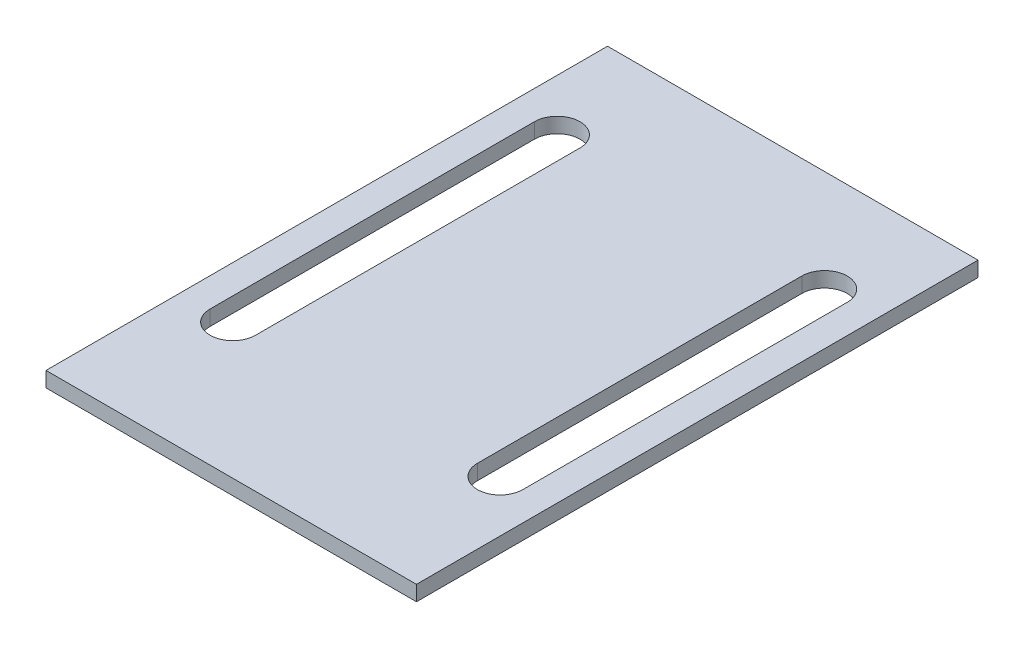
ISO-10303-21;
HEADER;
FILE_DESCRIPTION(('STEP AP214'),'2;1');
FILE_NAME('part.step','',(''),(''),'','','');
FILE_SCHEMA(('AUTOMOTIVE_DESIGN { 1 0 10303 214 1 1 1 1 }'));
ENDSEC;
DATA;
#1=APPLICATION_CONTEXT('core data for automotive mechanical design processes');
#2=APPLICATION_PROTOCOL_DEFINITION('international standard','automotive_design',2000,#1);
#3=PRODUCT_CONTEXT('',#1,'mechanical');
#4=PRODUCT('Part','Part','',(#3));
#5=PRODUCT_RELATED_PRODUCT_CATEGORY('part','',(#4));
#6=PRODUCT_DEFINITION_FORMATION('','',#4);
#7=PRODUCT_DEFINITION_CONTEXT('part definition',#1,'design');
#8=PRODUCT_DEFINITION('design','',#6,#7);
#9=PRODUCT_DEFINITION_SHAPE('','',#8);
#10=(LENGTH_UNIT() NAMED_UNIT(*) SI_UNIT(.MILLI.,.METRE.));
#11=(NAMED_UNIT(*) PLANE_ANGLE_UNIT() SI_UNIT($,.RADIAN.));
#12=(NAMED_UNIT(*) SI_UNIT($,.STERADIAN.) SOLID_ANGLE_UNIT());
#13=UNCERTAINTY_MEASURE_WITH_UNIT(LENGTH_MEASURE(1.E-05),#10,'distance_accuracy_value','');
#14=(GEOMETRIC_REPRESENTATION_CONTEXT(3) GLOBAL_UNCERTAINTY_ASSIGNED_CONTEXT((#13)) GLOBAL_UNIT_ASSIGNED_CONTEXT((#10,
#11,#12)) REPRESENTATION_CONTEXT('',''));
#15=CARTESIAN_POINT('',(0.,0.,0.));
#16=DIRECTION('',(0.,0.,1.));
#17=DIRECTION('',(1.,0.,0.));
#18=AXIS2_PLACEMENT_3D('',#15,#16,#17);
#19=CARTESIAN_POINT('',(0.,5.,0.));
#20=DIRECTION('',(0.,1.,0.));
#21=DIRECTION('',(0.,0.,1.));
#22=AXIS2_PLACEMENT_3D('',#19,#20,#21);
#23=PLANE('',#22);
#24=DIRECTION('',(0.,0.,1.));
#25=VECTOR('',#24,1.);
#26=CARTESIAN_POINT('',(9.50000000000004,5.,0.));
#27=LINE('',#26,#25);
#28=CARTESIAN_POINT('',(9.50000000000004,5.,-152.22156802));
#29=VERTEX_POINT('',#28);
#30=CARTESIAN_POINT('',(9.50000000000003,5.,-45.30156802));
#31=VERTEX_POINT('',#30);
#32=EDGE_CURVE('E159',#29,#31,#27,.T.);
#33=ORIENTED_EDGE('',*,*,#32,.F.);
#34=CARTESIAN_POINT('',(17.,5.,-152.22156802));
#35=DIRECTION('',(0.,1.,0.));
#36=DIRECTION('',(0.,0.,1.));
#37=AXIS2_PLACEMENT_3D('',#34,#35,#36);
#38=CIRCLE('',#37,7.49999999999997);
#39=CARTESIAN_POINT('',(24.5,5.,-152.22156802));
#40=VERTEX_POINT('',#39);
#41=EDGE_CURVE('E193',#40,#29,#38,.T.);
#42=ORIENTED_EDGE('',*,*,#41,.F.);
#43=DIRECTION('',(0.,0.,1.));
#44=VECTOR('',#43,1.);
#45=CARTESIAN_POINT('',(24.5000000000001,5.,0.));
#46=LINE('',#45,#44);
#47=CARTESIAN_POINT('',(24.5,5.,-45.30156802));
#48=VERTEX_POINT('',#47);
#49=EDGE_CURVE('E207',#40,#48,#46,.T.);
#50=ORIENTED_EDGE('',*,*,#49,.T.);
#51=CARTESIAN_POINT('',(17.,5.,-45.30156802));
#52=DIRECTION('',(0.,1.,0.));
#53=DIRECTION('',(0.,0.,1.));
#54=AXIS2_PLACEMENT_3D('',#51,#52,#53);
#55=CIRCLE('',#54,7.5);
#56=EDGE_CURVE('E204',#31,#48,#55,.T.);
#57=ORIENTED_EDGE('',*,*,#56,.F.);
#58=EDGE_LOOP('',(#33,#42,#50,#57));
#59=FACE_BOUND('',#58,.T.);
#60=DIRECTION('',(0.,0.,1.));
#61=VECTOR('',#60,1.);
#62=CARTESIAN_POINT('',(112.6,5.,0.));
#63=LINE('',#62,#61);
#64=CARTESIAN_POINT('',(112.6,5.,-152.22156802));
#65=VERTEX_POINT('',#64);
#66=CARTESIAN_POINT('',(112.6,5.,-45.30156802));
#67=VERTEX_POINT('',#66);
#68=EDGE_CURVE('E173',#65,#67,#63,.T.);
#69=ORIENTED_EDGE('',*,*,#68,.T.);
#70=CARTESIAN_POINT('',(105.1,5.,-45.30156802));
#71=DIRECTION('',(0.,1.,0.));
#72=DIRECTION('',(0.,0.,1.));
#73=AXIS2_PLACEMENT_3D('',#70,#71,#72);
#74=CIRCLE('',#73,7.49999999999999);
#75=CARTESIAN_POINT('',(97.6,5.,-45.30156802));
#76=VERTEX_POINT('',#75);
#77=EDGE_CURVE('E62',#67,#76,#74,.F.);
#78=ORIENTED_EDGE('',*,*,#77,.T.);
#79=DIRECTION('',(0.,0.,1.));
#80=VECTOR('',#79,1.);
#81=CARTESIAN_POINT('',(97.6,5.,0.));
#82=LINE('',#81,#80);
#83=CARTESIAN_POINT('',(97.6,5.,-152.22156802));
#84=VERTEX_POINT('',#83);
#85=EDGE_CURVE('E163',#84,#76,#82,.T.);
#86=ORIENTED_EDGE('',*,*,#85,.F.);
#87=CARTESIAN_POINT('',(105.1,5.,-152.22156802));
#88=DIRECTION('',(0.,1.,0.));
#89=DIRECTION('',(0.,0.,1.));
#90=AXIS2_PLACEMENT_3D('',#87,#88,#89);
#91=CIRCLE('',#90,7.49999999999997);
#92=EDGE_CURVE('E177',#84,#65,#91,.F.);
#93=ORIENTED_EDGE('',*,*,#92,.T.);
#94=EDGE_LOOP('',(#69,#78,#86,#93));
#95=FACE_BOUND('',#94,.T.);
#96=DIRECTION('',(0.,0.,-1.));
#97=VECTOR('',#96,1.);
#98=CARTESIAN_POINT('',(0.,5.,0.));
#99=LINE('',#98,#97);
#100=CARTESIAN_POINT('',(0.,5.,-0.730000000000002));
#101=VERTEX_POINT('',#100);
#102=CARTESIAN_POINT('',(0.,5.,-185.8));
#103=VERTEX_POINT('',#102);
#104=EDGE_CURVE('E47',#101,#103,#99,.T.);
#105=ORIENTED_EDGE('',*,*,#104,.F.);
#106=DIRECTION('',(-1.,0.,0.));
#107=VECTOR('',#106,1.);
#108=CARTESIAN_POINT('',(0.,5.,-0.730000000000002));
#109=LINE('',#108,#107);
#110=CARTESIAN_POINT('',(122.1,5.,-0.730000000000002));
#111=VERTEX_POINT('',#110);
#112=EDGE_CURVE('E146',#111,#101,#109,.T.);
#113=ORIENTED_EDGE('',*,*,#112,.F.);
#114=DIRECTION('',(0.,0.,-1.));
#115=VECTOR('',#114,1.);
#116=CARTESIAN_POINT('',(122.1,5.,0.));
#117=LINE('',#116,#115);
#118=CARTESIAN_POINT('',(122.1,5.,-185.8));
#119=VERTEX_POINT('',#118);
#120=EDGE_CURVE('E133',#111,#119,#117,.T.);
#121=ORIENTED_EDGE('',*,*,#120,.T.);
#122=DIRECTION('',(-1.,0.,0.));
#123=VECTOR('',#122,1.);
#124=CARTESIAN_POINT('',(0.,5.,-185.8));
#125=LINE('',#124,#123);
#126=EDGE_CURVE('E153',#119,#103,#125,.T.);
#127=ORIENTED_EDGE('',*,*,#126,.T.);
#128=EDGE_LOOP('',(#105,#113,#121,#127));
#129=FACE_BOUND('',#128,.T.);
#130=ADVANCED_FACE('F39',(#59,#95,#129),#23,.T.);
#131=CARTESIAN_POINT('',(0.,0.,0.));
#132=DIRECTION('',(0.,1.,0.));
#133=DIRECTION('',(0.,0.,1.));
#134=AXIS2_PLACEMENT_3D('',#131,#132,#133);
#135=PLANE('',#134);
#136=CARTESIAN_POINT('',(17.,0.,-152.22156802));
#137=DIRECTION('',(0.,1.,0.));
#138=DIRECTION('',(0.,0.,1.));
#139=AXIS2_PLACEMENT_3D('',#136,#137,#138);
#140=CIRCLE('',#139,7.49999999999997);
#141=CARTESIAN_POINT('',(24.5,0.,-152.22156802));
#142=VERTEX_POINT('',#141);
#143=CARTESIAN_POINT('',(9.50000000000004,0.,-152.22156802));
#144=VERTEX_POINT('',#143);
#145=EDGE_CURVE('E199',#142,#144,#140,.T.);
#146=ORIENTED_EDGE('',*,*,#145,.T.);
#147=DIRECTION('',(0.,0.,1.));
#148=VECTOR('',#147,1.);
#149=CARTESIAN_POINT('',(9.50000000000004,0.,0.));
#150=LINE('',#149,#148);
#151=CARTESIAN_POINT('',(9.50000000000004,0.,-45.30156802));
#152=VERTEX_POINT('',#151);
#153=EDGE_CURVE('E189',#144,#152,#150,.T.);
#154=ORIENTED_EDGE('',*,*,#153,.T.);
#155=CARTESIAN_POINT('',(17.,0.,-45.30156802));
#156=DIRECTION('',(0.,1.,0.));
#157=DIRECTION('',(0.,0.,1.));
#158=AXIS2_PLACEMENT_3D('',#155,#156,#157);
#159=CIRCLE('',#158,7.5);
#160=CARTESIAN_POINT('',(24.5,0.,-45.30156802));
#161=VERTEX_POINT('',#160);
#162=EDGE_CURVE('E192',#152,#161,#159,.T.);
#163=ORIENTED_EDGE('',*,*,#162,.T.);
#164=DIRECTION('',(0.,0.,1.));
#165=VECTOR('',#164,1.);
#166=CARTESIAN_POINT('',(24.5000000000001,0.,0.));
#167=LINE('',#166,#165);
#168=EDGE_CURVE('E196',#142,#161,#167,.T.);
#169=ORIENTED_EDGE('',*,*,#168,.F.);
#170=EDGE_LOOP('',(#146,#154,#163,#169));
#171=FACE_BOUND('',#170,.T.);
#172=CARTESIAN_POINT('',(105.1,0.,-45.30156802));
#173=DIRECTION('',(0.,1.,0.));
#174=DIRECTION('',(0.,0.,1.));
#175=AXIS2_PLACEMENT_3D('',#172,#173,#174);
#176=CIRCLE('',#175,7.49999999999999);
#177=CARTESIAN_POINT('',(112.6,0.,-45.30156802));
#178=VERTEX_POINT('',#177);
#179=CARTESIAN_POINT('',(97.6,0.,-45.30156802));
#180=VERTEX_POINT('',#179);
#181=EDGE_CURVE('E160',#178,#180,#176,.F.);
#182=ORIENTED_EDGE('',*,*,#181,.F.);
#183=DIRECTION('',(0.,0.,1.));
#184=VECTOR('',#183,1.);
#185=CARTESIAN_POINT('',(112.6,0.,0.));
#186=LINE('',#185,#184);
#187=CARTESIAN_POINT('',(112.6,0.,-152.22156802));
#188=VERTEX_POINT('',#187);
#189=EDGE_CURVE('E162',#188,#178,#186,.T.);
#190=ORIENTED_EDGE('',*,*,#189,.F.);
#191=CARTESIAN_POINT('',(105.1,0.,-152.22156802));
#192=DIRECTION('',(0.,1.,0.));
#193=DIRECTION('',(0.,0.,1.));
#194=AXIS2_PLACEMENT_3D('',#191,#192,#193);
#195=CIRCLE('',#194,7.49999999999997);
#196=CARTESIAN_POINT('',(97.6,0.,-152.22156802));
#197=VERTEX_POINT('',#196);
#198=EDGE_CURVE('E165',#197,#188,#195,.F.);
#199=ORIENTED_EDGE('',*,*,#198,.F.);
#200=DIRECTION('',(0.,0.,1.));
#201=VECTOR('',#200,1.);
#202=CARTESIAN_POINT('',(97.6,0.,0.));
#203=LINE('',#202,#201);
#204=EDGE_CURVE('E168',#197,#180,#203,.T.);
#205=ORIENTED_EDGE('',*,*,#204,.T.);
#206=EDGE_LOOP('',(#182,#190,#199,#205));
#207=FACE_BOUND('',#206,.T.);
#208=DIRECTION('',(0.,0.,-1.));
#209=VECTOR('',#208,1.);
#210=CARTESIAN_POINT('',(122.1,0.,0.));
#211=LINE('',#210,#209);
#212=CARTESIAN_POINT('',(122.1,0.,-0.730000000000002));
#213=VERTEX_POINT('',#212);
#214=CARTESIAN_POINT('',(122.1,0.,-185.8));
#215=VERTEX_POINT('',#214);
#216=EDGE_CURVE('E134',#213,#215,#211,.T.);
#217=ORIENTED_EDGE('',*,*,#216,.F.);
#218=DIRECTION('',(1.,0.,0.));
#219=VECTOR('',#218,1.);
#220=CARTESIAN_POINT('',(0.,0.,-0.730000000000002));
#221=LINE('',#220,#219);
#222=CARTESIAN_POINT('',(0.,0.,-0.730000000000002));
#223=VERTEX_POINT('',#222);
#224=EDGE_CURVE('E136',#223,#213,#221,.T.);
#225=ORIENTED_EDGE('',*,*,#224,.F.);
#226=DIRECTION('',(0.,0.,-1.));
#227=VECTOR('',#226,1.);
#228=CARTESIAN_POINT('',(0.,0.,0.));
#229=LINE('',#228,#227);
#230=CARTESIAN_POINT('',(0.,0.,-185.8));
#231=VERTEX_POINT('',#230);
#232=EDGE_CURVE('E54',#223,#231,#229,.T.);
#233=ORIENTED_EDGE('',*,*,#232,.T.);
#234=DIRECTION('',(-1.,0.,0.));
#235=VECTOR('',#234,1.);
#236=CARTESIAN_POINT('',(0.,0.,-185.8));
#237=LINE('',#236,#235);
#238=EDGE_CURVE('E151',#215,#231,#237,.T.);
#239=ORIENTED_EDGE('',*,*,#238,.F.);
#240=EDGE_LOOP('',(#217,#225,#233,#239));
#241=FACE_BOUND('',#240,.T.);
#242=ADVANCED_FACE('F137',(#171,#207,#241),#135,.F.);
#243=CARTESIAN_POINT('',(122.1,5.,0.));
#244=DIRECTION('',(-1.,0.,0.));
#245=DIRECTION('',(0.,0.,1.));
#246=AXIS2_PLACEMENT_3D('',#243,#244,#245);
#247=PLANE('',#246);
#248=ORIENTED_EDGE('',*,*,#120,.F.);
#249=DIRECTION('',(0.,1.,0.));
#250=VECTOR('',#249,1.);
#251=CARTESIAN_POINT('',(122.1,5.,-0.730000000000002));
#252=LINE('',#251,#250);
#253=EDGE_CURVE('E141',#213,#111,#252,.T.);
#254=ORIENTED_EDGE('',*,*,#253,.F.);
#255=ORIENTED_EDGE('',*,*,#216,.T.);
#256=DIRECTION('',(0.,-1.,0.));
#257=VECTOR('',#256,1.);
#258=CARTESIAN_POINT('',(122.1,5.,-185.8));
#259=LINE('',#258,#257);
#260=EDGE_CURVE('E156',#119,#215,#259,.T.);
#261=ORIENTED_EDGE('',*,*,#260,.F.);
#262=EDGE_LOOP('',(#248,#254,#255,#261));
#263=FACE_BOUND('',#262,.T.);
#264=ADVANCED_FACE('F41',(#263),#247,.F.);
#265=CARTESIAN_POINT('',(0.,5.,0.));
#266=DIRECTION('',(-1.,0.,0.));
#267=DIRECTION('',(0.,0.,1.));
#268=AXIS2_PLACEMENT_3D('',#265,#266,#267);
#269=PLANE('',#268);
#270=ORIENTED_EDGE('',*,*,#232,.F.);
#271=DIRECTION('',(0.,-1.,0.));
#272=VECTOR('',#271,1.);
#273=CARTESIAN_POINT('',(0.,5.,-0.730000000000002));
#274=LINE('',#273,#272);
#275=EDGE_CURVE('E131',#101,#223,#274,.T.);
#276=ORIENTED_EDGE('',*,*,#275,.F.);
#277=ORIENTED_EDGE('',*,*,#104,.T.);
#278=DIRECTION('',(0.,-1.,0.));
#279=VECTOR('',#278,1.);
#280=CARTESIAN_POINT('',(0.,5.,-185.8));
#281=LINE('',#280,#279);
#282=EDGE_CURVE('E11',#103,#231,#281,.T.);
#283=ORIENTED_EDGE('',*,*,#282,.T.);
#284=EDGE_LOOP('',(#270,#276,#277,#283));
#285=FACE_BOUND('',#284,.T.);
#286=ADVANCED_FACE('F129',(#285),#269,.T.);
#287=CARTESIAN_POINT('',(9.50000000000004,0.,0.));
#288=DIRECTION('',(-1.,0.,0.));
#289=DIRECTION('',(0.,0.,1.));
#290=AXIS2_PLACEMENT_3D('',#287,#288,#289);
#291=PLANE('',#290);
#292=ORIENTED_EDGE('',*,*,#32,.T.);
#293=DIRECTION('',(0.,1.,0.));
#294=VECTOR('',#293,1.);
#295=CARTESIAN_POINT('',(9.50000000000004,0.,-45.30156802));
#296=LINE('',#295,#294);
#297=EDGE_CURVE('E202',#152,#31,#296,.T.);
#298=ORIENTED_EDGE('',*,*,#297,.F.);
#299=ORIENTED_EDGE('',*,*,#153,.F.);
#300=DIRECTION('',(0.,1.,0.));
#301=VECTOR('',#300,1.);
#302=CARTESIAN_POINT('',(9.50000000000004,0.,-152.22156802));
#303=LINE('',#302,#301);
#304=EDGE_CURVE('E174',#144,#29,#303,.T.);
#305=ORIENTED_EDGE('',*,*,#304,.T.);
#306=EDGE_LOOP('',(#292,#298,#299,#305));
#307=FACE_BOUND('',#306,.T.);
#308=ADVANCED_FACE('F238',(#307),#291,.F.);
#309=CARTESIAN_POINT('',(17.,0.,-152.22156802));
#310=DIRECTION('',(0.,1.,0.));
#311=DIRECTION('',(0.,0.,1.));
#312=AXIS2_PLACEMENT_3D('',#309,#310,#311);
#313=CYLINDRICAL_SURFACE('',#312,7.49999999999997);
#314=ORIENTED_EDGE('',*,*,#41,.T.);
#315=ORIENTED_EDGE('',*,*,#304,.F.);
#316=ORIENTED_EDGE('',*,*,#145,.F.);
#317=DIRECTION('',(0.,1.,0.));
#318=VECTOR('',#317,1.);
#319=CARTESIAN_POINT('',(24.5,0.,-152.22156802));
#320=LINE('',#319,#318);
#321=EDGE_CURVE('E213',#142,#40,#320,.T.);
#322=ORIENTED_EDGE('',*,*,#321,.T.);
#323=EDGE_LOOP('',(#314,#315,#316,#322));
#324=FACE_BOUND('',#323,.T.);
#325=ADVANCED_FACE('F245',(#324),#313,.F.);
#326=CARTESIAN_POINT('',(24.5000000000001,0.,0.));
#327=DIRECTION('',(-1.,0.,0.));
#328=DIRECTION('',(0.,0.,1.));
#329=AXIS2_PLACEMENT_3D('',#326,#327,#328);
#330=PLANE('',#329);
#331=ORIENTED_EDGE('',*,*,#49,.F.);
#332=ORIENTED_EDGE('',*,*,#321,.F.);
#333=ORIENTED_EDGE('',*,*,#168,.T.);
#334=DIRECTION('',(0.,1.,0.));
#335=VECTOR('',#334,1.);
#336=CARTESIAN_POINT('',(24.5,0.,-45.30156802));
#337=LINE('',#336,#335);
#338=EDGE_CURVE('E215',#161,#48,#337,.T.);
#339=ORIENTED_EDGE('',*,*,#338,.T.);
#340=EDGE_LOOP('',(#331,#332,#333,#339));
#341=FACE_BOUND('',#340,.T.);
#342=ADVANCED_FACE('F318',(#341),#330,.T.);
#343=CARTESIAN_POINT('',(17.,0.,-45.30156802));
#344=DIRECTION('',(0.,1.,0.));
#345=DIRECTION('',(0.,0.,1.));
#346=AXIS2_PLACEMENT_3D('',#343,#344,#345);
#347=CYLINDRICAL_SURFACE('',#346,7.5);
#348=ORIENTED_EDGE('',*,*,#56,.T.);
#349=ORIENTED_EDGE('',*,*,#338,.F.);
#350=ORIENTED_EDGE('',*,*,#162,.F.);
#351=ORIENTED_EDGE('',*,*,#297,.T.);
#352=EDGE_LOOP('',(#348,#349,#350,#351));
#353=FACE_BOUND('',#352,.T.);
#354=ADVANCED_FACE('F309',(#353),#347,.F.);
#355=CARTESIAN_POINT('',(105.1,0.,-45.30156802));
#356=DIRECTION('',(0.,1.,0.));
#357=DIRECTION('',(0.,0.,1.));
#358=AXIS2_PLACEMENT_3D('',#355,#356,#357);
#359=CYLINDRICAL_SURFACE('',#358,7.49999999999999);
#360=ORIENTED_EDGE('',*,*,#77,.F.);
#361=DIRECTION('',(0.,1.,0.));
#362=VECTOR('',#361,1.);
#363=CARTESIAN_POINT('',(112.6,0.,-45.30156802));
#364=LINE('',#363,#362);
#365=EDGE_CURVE('E171',#178,#67,#364,.T.);
#366=ORIENTED_EDGE('',*,*,#365,.F.);
#367=ORIENTED_EDGE('',*,*,#181,.T.);
#368=DIRECTION('',(0.,1.,0.));
#369=VECTOR('',#368,1.);
#370=CARTESIAN_POINT('',(97.6,0.,-45.30156802));
#371=LINE('',#370,#369);
#372=EDGE_CURVE('E182',#180,#76,#371,.T.);
#373=ORIENTED_EDGE('',*,*,#372,.T.);
#374=EDGE_LOOP('',(#360,#366,#367,#373));
#375=FACE_BOUND('',#374,.T.);
#376=ADVANCED_FACE('F299',(#375),#359,.F.);
#377=CARTESIAN_POINT('',(97.6,0.,0.));
#378=DIRECTION('',(-1.,0.,0.));
#379=DIRECTION('',(0.,0.,1.));
#380=AXIS2_PLACEMENT_3D('',#377,#378,#379);
#381=PLANE('',#380);
#382=ORIENTED_EDGE('',*,*,#85,.T.);
#383=ORIENTED_EDGE('',*,*,#372,.F.);
#384=ORIENTED_EDGE('',*,*,#204,.F.);
#385=DIRECTION('',(0.,1.,0.));
#386=VECTOR('',#385,1.);
#387=CARTESIAN_POINT('',(97.6,0.,-152.22156802));
#388=LINE('',#387,#386);
#389=EDGE_CURVE('E184',#197,#84,#388,.T.);
#390=ORIENTED_EDGE('',*,*,#389,.T.);
#391=EDGE_LOOP('',(#382,#383,#384,#390));
#392=FACE_BOUND('',#391,.T.);
#393=ADVANCED_FACE('F289',(#392),#381,.F.);
#394=CARTESIAN_POINT('',(105.1,0.,-152.22156802));
#395=DIRECTION('',(0.,1.,0.));
#396=DIRECTION('',(0.,0.,1.));
#397=AXIS2_PLACEMENT_3D('',#394,#395,#396);
#398=CYLINDRICAL_SURFACE('',#397,7.49999999999997);
#399=ORIENTED_EDGE('',*,*,#92,.F.);
#400=ORIENTED_EDGE('',*,*,#389,.F.);
#401=ORIENTED_EDGE('',*,*,#198,.T.);
#402=DIRECTION('',(0.,1.,0.));
#403=VECTOR('',#402,1.);
#404=CARTESIAN_POINT('',(112.6,0.,-152.22156802));
#405=LINE('',#404,#403);
#406=EDGE_CURVE('E186',#188,#65,#405,.T.);
#407=ORIENTED_EDGE('',*,*,#406,.T.);
#408=EDGE_LOOP('',(#399,#400,#401,#407));
#409=FACE_BOUND('',#408,.T.);
#410=ADVANCED_FACE('F279',(#409),#398,.F.);
#411=CARTESIAN_POINT('',(112.6,0.,0.));
#412=DIRECTION('',(-1.,0.,0.));
#413=DIRECTION('',(0.,0.,1.));
#414=AXIS2_PLACEMENT_3D('',#411,#412,#413);
#415=PLANE('',#414);
#416=ORIENTED_EDGE('',*,*,#68,.F.);
#417=ORIENTED_EDGE('',*,*,#406,.F.);
#418=ORIENTED_EDGE('',*,*,#189,.T.);
#419=ORIENTED_EDGE('',*,*,#365,.T.);
#420=EDGE_LOOP('',(#416,#417,#418,#419));
#421=FACE_BOUND('',#420,.T.);
#422=ADVANCED_FACE('F268',(#421),#415,.T.);
#423=CARTESIAN_POINT('',(0.,0.,-185.8));
#424=DIRECTION('',(0.,0.,-1.));
#425=DIRECTION('',(-1.,0.,0.));
#426=AXIS2_PLACEMENT_3D('',#423,#424,#425);
#427=PLANE('',#426);
#428=ORIENTED_EDGE('',*,*,#260,.T.);
#429=ORIENTED_EDGE('',*,*,#238,.T.);
#430=ORIENTED_EDGE('',*,*,#282,.F.);
#431=ORIENTED_EDGE('',*,*,#126,.F.);
#432=EDGE_LOOP('',(#428,#429,#430,#431));
#433=FACE_BOUND('',#432,.T.);
#434=ADVANCED_FACE('F225',(#433),#427,.T.);
#435=CARTESIAN_POINT('',(0.,0.,-0.730000000000002));
#436=DIRECTION('',(0.,0.,1.));
#437=DIRECTION('',(1.,0.,0.));
#438=AXIS2_PLACEMENT_3D('',#435,#436,#437);
#439=PLANE('',#438);
#440=ORIENTED_EDGE('',*,*,#275,.T.);
#441=ORIENTED_EDGE('',*,*,#224,.T.);
#442=ORIENTED_EDGE('',*,*,#253,.T.);
#443=ORIENTED_EDGE('',*,*,#112,.T.);
#444=EDGE_LOOP('',(#440,#441,#442,#443));
#445=FACE_BOUND('',#444,.T.);
#446=ADVANCED_FACE('F144',(#445),#439,.T.);
#447=CLOSED_SHELL('',(#130,#242,#264,#286,#308,#325,#342,#354,#376,#393,#410,#422,#434,#446));
#448=MANIFOLD_SOLID_BREP('B2',#447);
#449=ADVANCED_BREP_SHAPE_REPRESENTATION('',(#18,#448),#14);
#450=SHAPE_DEFINITION_REPRESENTATION(#9,#449);
ENDSEC;
END-ISO-10303-21;
